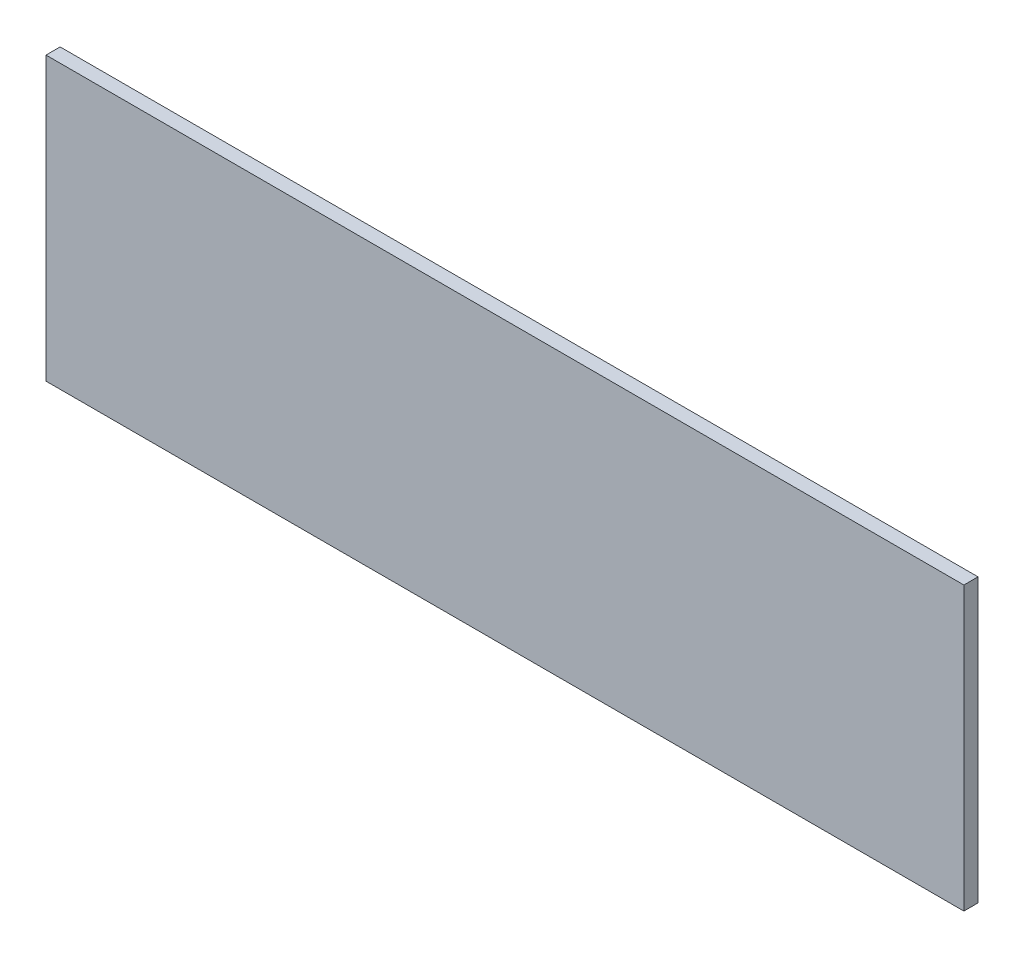
ISO-10303-21;
HEADER;
FILE_DESCRIPTION(('STEP AP214'),'2;1');
FILE_NAME('part.step','',(''),(''),'','','');
FILE_SCHEMA(('AUTOMOTIVE_DESIGN { 1 0 10303 214 1 1 1 1 }'));
ENDSEC;
DATA;
#1=APPLICATION_CONTEXT('core data for automotive mechanical design processes');
#2=APPLICATION_PROTOCOL_DEFINITION('international standard','automotive_design',2000,#1);
#3=PRODUCT_CONTEXT('',#1,'mechanical');
#4=PRODUCT('Part','Part','',(#3));
#5=PRODUCT_RELATED_PRODUCT_CATEGORY('part','',(#4));
#6=PRODUCT_DEFINITION_FORMATION('','',#4);
#7=PRODUCT_DEFINITION_CONTEXT('part definition',#1,'design');
#8=PRODUCT_DEFINITION('design','',#6,#7);
#9=PRODUCT_DEFINITION_SHAPE('','',#8);
#10=(LENGTH_UNIT() NAMED_UNIT(*) SI_UNIT(.MILLI.,.METRE.));
#11=(NAMED_UNIT(*) PLANE_ANGLE_UNIT() SI_UNIT($,.RADIAN.));
#12=(NAMED_UNIT(*) SI_UNIT($,.STERADIAN.) SOLID_ANGLE_UNIT());
#13=UNCERTAINTY_MEASURE_WITH_UNIT(LENGTH_MEASURE(1.E-05),#10,'distance_accuracy_value','');
#14=(GEOMETRIC_REPRESENTATION_CONTEXT(3) GLOBAL_UNCERTAINTY_ASSIGNED_CONTEXT((#13)) GLOBAL_UNIT_ASSIGNED_CONTEXT((#10,
#11,#12)) REPRESENTATION_CONTEXT('',''));
#15=CARTESIAN_POINT('',(0.,0.,0.));
#16=DIRECTION('',(0.,0.,1.));
#17=DIRECTION('',(1.,0.,0.));
#18=AXIS2_PLACEMENT_3D('',#15,#16,#17);
#19=CARTESIAN_POINT('',(0.,0.,10.));
#20=DIRECTION('',(1.,0.,0.));
#21=DIRECTION('',(0.,0.,-1.));
#22=AXIS2_PLACEMENT_3D('',#19,#20,#21);
#23=PLANE('',#22);
#24=DIRECTION('',(0.,-1.,0.));
#25=VECTOR('',#24,1.);
#26=CARTESIAN_POINT('',(0.,0.,0.));
#27=LINE('',#26,#25);
#28=CARTESIAN_POINT('',(0.,200.,0.));
#29=VERTEX_POINT('',#28);
#30=CARTESIAN_POINT('',(0.,0.,0.));
#31=VERTEX_POINT('',#30);
#32=EDGE_CURVE('E95',#29,#31,#27,.T.);
#33=ORIENTED_EDGE('',*,*,#32,.T.);
#34=DIRECTION('',(0.,0.,-1.));
#35=VECTOR('',#34,1.);
#36=CARTESIAN_POINT('',(0.,0.,10.));
#37=LINE('',#36,#35);
#38=CARTESIAN_POINT('',(0.,0.,10.));
#39=VERTEX_POINT('',#38);
#40=EDGE_CURVE('E11',#39,#31,#37,.T.);
#41=ORIENTED_EDGE('',*,*,#40,.F.);
#42=DIRECTION('',(0.,-1.,0.));
#43=VECTOR('',#42,1.);
#44=CARTESIAN_POINT('',(0.,0.,10.));
#45=LINE('',#44,#43);
#46=CARTESIAN_POINT('',(0.,200.,10.));
#47=VERTEX_POINT('',#46);
#48=EDGE_CURVE('E83',#47,#39,#45,.T.);
#49=ORIENTED_EDGE('',*,*,#48,.F.);
#50=DIRECTION('',(0.,0.,-1.));
#51=VECTOR('',#50,1.);
#52=CARTESIAN_POINT('',(0.,200.,10.));
#53=LINE('',#52,#51);
#54=EDGE_CURVE('E91',#47,#29,#53,.T.);
#55=ORIENTED_EDGE('',*,*,#54,.T.);
#56=EDGE_LOOP('',(#33,#41,#49,#55));
#57=FACE_BOUND('',#56,.T.);
#58=ADVANCED_FACE('F32',(#57),#23,.F.);
#59=CARTESIAN_POINT('',(0.,0.,10.));
#60=DIRECTION('',(0.,1.,0.));
#61=DIRECTION('',(0.,0.,1.));
#62=AXIS2_PLACEMENT_3D('',#59,#60,#61);
#63=PLANE('',#62);
#64=DIRECTION('',(1.,0.,0.));
#65=VECTOR('',#64,1.);
#66=CARTESIAN_POINT('',(0.,0.,0.));
#67=LINE('',#66,#65);
#68=CARTESIAN_POINT('',(650.,0.,0.));
#69=VERTEX_POINT('',#68);
#70=EDGE_CURVE('E87',#31,#69,#67,.T.);
#71=ORIENTED_EDGE('',*,*,#70,.T.);
#72=DIRECTION('',(0.,0.,-1.));
#73=VECTOR('',#72,1.);
#74=CARTESIAN_POINT('',(650.,0.,10.));
#75=LINE('',#74,#73);
#76=CARTESIAN_POINT('',(650.,0.,10.));
#77=VERTEX_POINT('',#76);
#78=EDGE_CURVE('E40',#77,#69,#75,.T.);
#79=ORIENTED_EDGE('',*,*,#78,.F.);
#80=DIRECTION('',(1.,0.,0.));
#81=VECTOR('',#80,1.);
#82=CARTESIAN_POINT('',(0.,0.,10.));
#83=LINE('',#82,#81);
#84=EDGE_CURVE('E78',#39,#77,#83,.T.);
#85=ORIENTED_EDGE('',*,*,#84,.F.);
#86=ORIENTED_EDGE('',*,*,#40,.T.);
#87=EDGE_LOOP('',(#71,#79,#85,#86));
#88=FACE_BOUND('',#87,.T.);
#89=ADVANCED_FACE('F86',(#88),#63,.F.);
#90=CARTESIAN_POINT('',(650.,0.,10.));
#91=DIRECTION('',(-1.,0.,0.));
#92=DIRECTION('',(0.,0.,1.));
#93=AXIS2_PLACEMENT_3D('',#90,#91,#92);
#94=PLANE('',#93);
#95=DIRECTION('',(0.,1.,0.));
#96=VECTOR('',#95,1.);
#97=CARTESIAN_POINT('',(650.,0.,0.));
#98=LINE('',#97,#96);
#99=CARTESIAN_POINT('',(650.,200.,0.));
#100=VERTEX_POINT('',#99);
#101=EDGE_CURVE('E65',#69,#100,#98,.T.);
#102=ORIENTED_EDGE('',*,*,#101,.T.);
#103=DIRECTION('',(0.,0.,-1.));
#104=VECTOR('',#103,1.);
#105=CARTESIAN_POINT('',(650.,200.,10.));
#106=LINE('',#105,#104);
#107=CARTESIAN_POINT('',(650.,200.,10.));
#108=VERTEX_POINT('',#107);
#109=EDGE_CURVE('E88',#108,#100,#106,.T.);
#110=ORIENTED_EDGE('',*,*,#109,.F.);
#111=DIRECTION('',(0.,1.,0.));
#112=VECTOR('',#111,1.);
#113=CARTESIAN_POINT('',(650.,0.,10.));
#114=LINE('',#113,#112);
#115=EDGE_CURVE('E81',#77,#108,#114,.T.);
#116=ORIENTED_EDGE('',*,*,#115,.F.);
#117=ORIENTED_EDGE('',*,*,#78,.T.);
#118=EDGE_LOOP('',(#102,#110,#116,#117));
#119=FACE_BOUND('',#118,.T.);
#120=ADVANCED_FACE('F89',(#119),#94,.F.);
#121=CARTESIAN_POINT('',(0.,200.,10.));
#122=DIRECTION('',(0.,-1.,0.));
#123=DIRECTION('',(0.,0.,-1.));
#124=AXIS2_PLACEMENT_3D('',#121,#122,#123);
#125=PLANE('',#124);
#126=DIRECTION('',(-1.,0.,0.));
#127=VECTOR('',#126,1.);
#128=CARTESIAN_POINT('',(0.,200.,0.));
#129=LINE('',#128,#127);
#130=EDGE_CURVE('E71',#100,#29,#129,.T.);
#131=ORIENTED_EDGE('',*,*,#130,.T.);
#132=ORIENTED_EDGE('',*,*,#54,.F.);
#133=DIRECTION('',(-1.,0.,0.));
#134=VECTOR('',#133,1.);
#135=CARTESIAN_POINT('',(0.,200.,10.));
#136=LINE('',#135,#134);
#137=EDGE_CURVE('E48',#108,#47,#136,.T.);
#138=ORIENTED_EDGE('',*,*,#137,.F.);
#139=ORIENTED_EDGE('',*,*,#109,.T.);
#140=EDGE_LOOP('',(#131,#132,#138,#139));
#141=FACE_BOUND('',#140,.T.);
#142=ADVANCED_FACE('F102',(#141),#125,.F.);
#143=CARTESIAN_POINT('',(0.,0.,10.));
#144=DIRECTION('',(0.,0.,-1.));
#145=DIRECTION('',(-1.,0.,0.));
#146=AXIS2_PLACEMENT_3D('',#143,#144,#145);
#147=PLANE('',#146);
#148=ORIENTED_EDGE('',*,*,#48,.T.);
#149=ORIENTED_EDGE('',*,*,#84,.T.);
#150=ORIENTED_EDGE('',*,*,#115,.T.);
#151=ORIENTED_EDGE('',*,*,#137,.T.);
#152=EDGE_LOOP('',(#148,#149,#150,#151));
#153=FACE_BOUND('',#152,.T.);
#154=ADVANCED_FACE('F79',(#153),#147,.F.);
#155=CARTESIAN_POINT('',(0.,0.,0.));
#156=DIRECTION('',(0.,0.,-1.));
#157=DIRECTION('',(-1.,0.,0.));
#158=AXIS2_PLACEMENT_3D('',#155,#156,#157);
#159=PLANE('',#158);
#160=ORIENTED_EDGE('',*,*,#32,.F.);
#161=ORIENTED_EDGE('',*,*,#130,.F.);
#162=ORIENTED_EDGE('',*,*,#101,.F.);
#163=ORIENTED_EDGE('',*,*,#70,.F.);
#164=EDGE_LOOP('',(#160,#161,#162,#163));
#165=FACE_BOUND('',#164,.T.);
#166=ADVANCED_FACE('F105',(#165),#159,.T.);
#167=CLOSED_SHELL('',(#58,#89,#120,#142,#154,#166));
#168=MANIFOLD_SOLID_BREP('B2',#167);
#169=ADVANCED_BREP_SHAPE_REPRESENTATION('',(#18,#168),#14);
#170=SHAPE_DEFINITION_REPRESENTATION(#9,#169);
ENDSEC;
END-ISO-10303-21;
